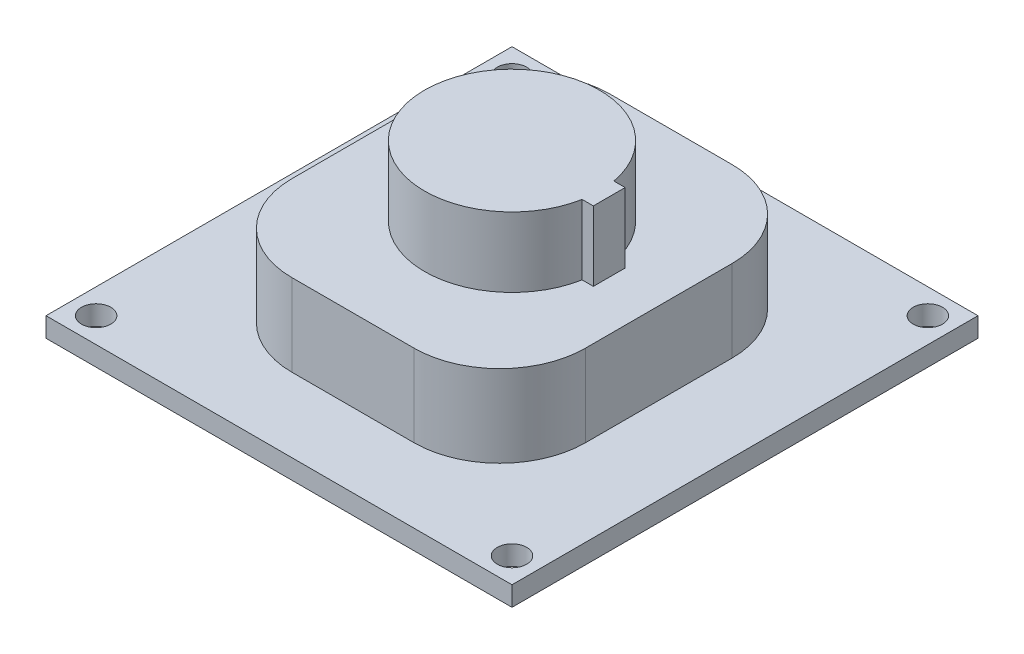
ISO-10303-21;
HEADER;
FILE_DESCRIPTION(('STEP AP214'),'2;1');
FILE_NAME('part.step','',(''),(''),'','','');
FILE_SCHEMA(('AUTOMOTIVE_DESIGN { 1 0 10303 214 1 1 1 1 }'));
ENDSEC;
DATA;
#1=APPLICATION_CONTEXT('core data for automotive mechanical design processes');
#2=APPLICATION_PROTOCOL_DEFINITION('international standard','automotive_design',2000,#1);
#3=PRODUCT_CONTEXT('',#1,'mechanical');
#4=PRODUCT('Part','Part','',(#3));
#5=PRODUCT_RELATED_PRODUCT_CATEGORY('part','',(#4));
#6=PRODUCT_DEFINITION_FORMATION('','',#4);
#7=PRODUCT_DEFINITION_CONTEXT('part definition',#1,'design');
#8=PRODUCT_DEFINITION('design','',#6,#7);
#9=PRODUCT_DEFINITION_SHAPE('','',#8);
#10=(LENGTH_UNIT() NAMED_UNIT(*) SI_UNIT(.MILLI.,.METRE.));
#11=(NAMED_UNIT(*) PLANE_ANGLE_UNIT() SI_UNIT($,.RADIAN.));
#12=(NAMED_UNIT(*) SI_UNIT($,.STERADIAN.) SOLID_ANGLE_UNIT());
#13=UNCERTAINTY_MEASURE_WITH_UNIT(LENGTH_MEASURE(1.E-05),#10,'distance_accuracy_value','');
#14=(GEOMETRIC_REPRESENTATION_CONTEXT(3) GLOBAL_UNCERTAINTY_ASSIGNED_CONTEXT((#13)) GLOBAL_UNIT_ASSIGNED_CONTEXT((#10,
#11,#12)) REPRESENTATION_CONTEXT('',''));
#15=CARTESIAN_POINT('',(0.,0.,0.));
#16=DIRECTION('',(0.,0.,1.));
#17=DIRECTION('',(1.,0.,0.));
#18=AXIS2_PLACEMENT_3D('',#15,#16,#17);
#19=CARTESIAN_POINT('',(5.,8.3,-6.));
#20=DIRECTION('',(0.,-1.,0.));
#21=DIRECTION('',(0.,0.,-1.));
#22=AXIS2_PLACEMENT_3D('',#19,#20,#21);
#23=PLANE('',#22);
#24=CARTESIAN_POINT('',(5.,8.3,-6.));
#25=DIRECTION('',(0.,1.,0.));
#26=DIRECTION('',(0.,0.,-1.));
#27=AXIS2_PLACEMENT_3D('',#24,#25,#26);
#28=CIRCLE('',#27,7.);
#29=CARTESIAN_POINT('',(12.,8.3,-6.));
#30=VERTEX_POINT('',#29);
#31=CARTESIAN_POINT('',(5.,8.3,-13.));
#32=VERTEX_POINT('',#31);
#33=EDGE_CURVE('E185',#30,#32,#28,.T.);
#34=ORIENTED_EDGE('',*,*,#33,.T.);
#35=DIRECTION('',(-1.,0.,0.));
#36=VECTOR('',#35,1.);
#37=CARTESIAN_POINT('',(-5.,8.3,-13.));
#38=LINE('',#37,#36);
#39=CARTESIAN_POINT('',(-5.,8.3,-13.));
#40=VERTEX_POINT('',#39);
#41=EDGE_CURVE('E188',#32,#40,#38,.T.);
#42=ORIENTED_EDGE('',*,*,#41,.T.);
#43=CARTESIAN_POINT('',(-5.,8.3,-6.));
#44=DIRECTION('',(0.,1.,0.));
#45=DIRECTION('',(0.,0.,1.));
#46=AXIS2_PLACEMENT_3D('',#43,#44,#45);
#47=CIRCLE('',#46,7.);
#48=CARTESIAN_POINT('',(-12.,8.3,-6.));
#49=VERTEX_POINT('',#48);
#50=EDGE_CURVE('E191',#40,#49,#47,.T.);
#51=ORIENTED_EDGE('',*,*,#50,.T.);
#52=DIRECTION('',(0.,0.,1.));
#53=VECTOR('',#52,1.);
#54=CARTESIAN_POINT('',(-12.,8.3,-6.));
#55=LINE('',#54,#53);
#56=CARTESIAN_POINT('',(-12.,8.3,6.));
#57=VERTEX_POINT('',#56);
#58=EDGE_CURVE('E193',#49,#57,#55,.T.);
#59=ORIENTED_EDGE('',*,*,#58,.T.);
#60=CARTESIAN_POINT('',(-5.,8.3,6.));
#61=DIRECTION('',(0.,1.,0.));
#62=DIRECTION('',(0.,0.,1.));
#63=AXIS2_PLACEMENT_3D('',#60,#61,#62);
#64=CIRCLE('',#63,7.);
#65=CARTESIAN_POINT('',(-5.,8.3,13.));
#66=VERTEX_POINT('',#65);
#67=EDGE_CURVE('E195',#57,#66,#64,.T.);
#68=ORIENTED_EDGE('',*,*,#67,.T.);
#69=DIRECTION('',(1.,0.,0.));
#70=VECTOR('',#69,1.);
#71=CARTESIAN_POINT('',(-5.,8.3,13.));
#72=LINE('',#71,#70);
#73=CARTESIAN_POINT('',(5.,8.3,13.));
#74=VERTEX_POINT('',#73);
#75=EDGE_CURVE('E197',#66,#74,#72,.T.);
#76=ORIENTED_EDGE('',*,*,#75,.T.);
#77=CARTESIAN_POINT('',(5.,8.3,6.));
#78=DIRECTION('',(0.,1.,0.));
#79=DIRECTION('',(0.,0.,1.));
#80=AXIS2_PLACEMENT_3D('',#77,#78,#79);
#81=CIRCLE('',#80,7.);
#82=CARTESIAN_POINT('',(12.,8.3,6.));
#83=VERTEX_POINT('',#82);
#84=EDGE_CURVE('E199',#74,#83,#81,.T.);
#85=ORIENTED_EDGE('',*,*,#84,.T.);
#86=DIRECTION('',(0.,0.,-1.));
#87=VECTOR('',#86,1.);
#88=CARTESIAN_POINT('',(12.,8.3,-6.));
#89=LINE('',#88,#87);
#90=EDGE_CURVE('E201',#83,#30,#89,.T.);
#91=ORIENTED_EDGE('',*,*,#90,.T.);
#92=EDGE_LOOP('',(#34,#42,#51,#59,#68,#76,#85,#91));
#93=FACE_BOUND('',#92,.T.);
#94=CARTESIAN_POINT('',(0.,8.3,0.));
#95=DIRECTION('',(0.,1.,0.));
#96=DIRECTION('',(0.,0.,1.));
#97=AXIS2_PLACEMENT_3D('',#94,#95,#96);
#98=CIRCLE('',#97,7.15);
#99=CARTESIAN_POINT('',(7.03082498715478,8.3,-1.3));
#100=VERTEX_POINT('',#99);
#101=CARTESIAN_POINT('',(7.03082498715478,8.3,1.3));
#102=VERTEX_POINT('',#101);
#103=EDGE_CURVE('E58',#100,#102,#98,.T.);
#104=ORIENTED_EDGE('',*,*,#103,.F.);
#105=DIRECTION('',(-1.,0.,0.));
#106=VECTOR('',#105,1.);
#107=CARTESIAN_POINT('',(7.03082498715478,8.3,-1.3));
#108=LINE('',#107,#106);
#109=CARTESIAN_POINT('',(7.95,8.3,-1.3));
#110=VERTEX_POINT('',#109);
#111=EDGE_CURVE('E62',#110,#100,#108,.T.);
#112=ORIENTED_EDGE('',*,*,#111,.F.);
#113=DIRECTION('',(0.,0.,-1.));
#114=VECTOR('',#113,1.);
#115=CARTESIAN_POINT('',(7.95,8.3,-1.3));
#116=LINE('',#115,#114);
#117=CARTESIAN_POINT('',(7.95,8.3,1.3));
#118=VERTEX_POINT('',#117);
#119=EDGE_CURVE('E514',#118,#110,#116,.T.);
#120=ORIENTED_EDGE('',*,*,#119,.F.);
#121=DIRECTION('',(1.,0.,0.));
#122=VECTOR('',#121,1.);
#123=CARTESIAN_POINT('',(7.03082498715478,8.3,1.3));
#124=LINE('',#123,#122);
#125=EDGE_CURVE('E520',#102,#118,#124,.T.);
#126=ORIENTED_EDGE('',*,*,#125,.F.);
#127=EDGE_LOOP('',(#104,#112,#120,#126));
#128=FACE_BOUND('',#127,.T.);
#129=ADVANCED_FACE('F43',(#93,#128),#23,.F.);
#130=CARTESIAN_POINT('',(0.,1.6,0.));
#131=DIRECTION('',(0.,1.,0.));
#132=DIRECTION('',(0.,0.,1.));
#133=AXIS2_PLACEMENT_3D('',#130,#131,#132);
#134=PLANE('',#133);
#135=CARTESIAN_POINT('',(5.,1.6,-6.));
#136=DIRECTION('',(0.,1.,0.));
#137=DIRECTION('',(0.,0.,-1.));
#138=AXIS2_PLACEMENT_3D('',#135,#136,#137);
#139=CIRCLE('',#138,7.);
#140=CARTESIAN_POINT('',(12.,1.6,-6.));
#141=VERTEX_POINT('',#140);
#142=CARTESIAN_POINT('',(5.,1.6,-13.));
#143=VERTEX_POINT('',#142);
#144=EDGE_CURVE('E176',#141,#143,#139,.T.);
#145=ORIENTED_EDGE('',*,*,#144,.F.);
#146=DIRECTION('',(0.,0.,-1.));
#147=VECTOR('',#146,1.);
#148=CARTESIAN_POINT('',(12.,1.6,-6.));
#149=LINE('',#148,#147);
#150=CARTESIAN_POINT('',(12.,1.6,6.));
#151=VERTEX_POINT('',#150);
#152=EDGE_CURVE('E189',#151,#141,#149,.T.);
#153=ORIENTED_EDGE('',*,*,#152,.F.);
#154=CARTESIAN_POINT('',(5.,1.6,6.));
#155=DIRECTION('',(0.,1.,0.));
#156=DIRECTION('',(0.,0.,1.));
#157=AXIS2_PLACEMENT_3D('',#154,#155,#156);
#158=CIRCLE('',#157,7.);
#159=CARTESIAN_POINT('',(5.,1.6,13.));
#160=VERTEX_POINT('',#159);
#161=EDGE_CURVE('E218',#160,#151,#158,.T.);
#162=ORIENTED_EDGE('',*,*,#161,.F.);
#163=DIRECTION('',(1.,0.,0.));
#164=VECTOR('',#163,1.);
#165=CARTESIAN_POINT('',(-5.,1.6,13.));
#166=LINE('',#165,#164);
#167=CARTESIAN_POINT('',(-5.,1.6,13.));
#168=VERTEX_POINT('',#167);
#169=EDGE_CURVE('E215',#168,#160,#166,.T.);
#170=ORIENTED_EDGE('',*,*,#169,.F.);
#171=CARTESIAN_POINT('',(-5.,1.6,6.));
#172=DIRECTION('',(0.,1.,0.));
#173=DIRECTION('',(0.,0.,1.));
#174=AXIS2_PLACEMENT_3D('',#171,#172,#173);
#175=CIRCLE('',#174,7.);
#176=CARTESIAN_POINT('',(-12.,1.6,6.));
#177=VERTEX_POINT('',#176);
#178=EDGE_CURVE('E212',#177,#168,#175,.T.);
#179=ORIENTED_EDGE('',*,*,#178,.F.);
#180=DIRECTION('',(0.,0.,1.));
#181=VECTOR('',#180,1.);
#182=CARTESIAN_POINT('',(-12.,1.6,-6.));
#183=LINE('',#182,#181);
#184=CARTESIAN_POINT('',(-12.,1.6,-6.));
#185=VERTEX_POINT('',#184);
#186=EDGE_CURVE('E209',#185,#177,#183,.T.);
#187=ORIENTED_EDGE('',*,*,#186,.F.);
#188=CARTESIAN_POINT('',(-5.,1.6,-6.));
#189=DIRECTION('',(0.,1.,0.));
#190=DIRECTION('',(0.,0.,1.));
#191=AXIS2_PLACEMENT_3D('',#188,#189,#190);
#192=CIRCLE('',#191,7.);
#193=CARTESIAN_POINT('',(-5.,1.6,-13.));
#194=VERTEX_POINT('',#193);
#195=EDGE_CURVE('E206',#194,#185,#192,.T.);
#196=ORIENTED_EDGE('',*,*,#195,.F.);
#197=DIRECTION('',(-1.,0.,0.));
#198=VECTOR('',#197,1.);
#199=CARTESIAN_POINT('',(-5.,1.6,-13.));
#200=LINE('',#199,#198);
#201=EDGE_CURVE('E179',#143,#194,#200,.T.);
#202=ORIENTED_EDGE('',*,*,#201,.F.);
#203=EDGE_LOOP('',(#145,#153,#162,#170,#179,#187,#196,#202));
#204=FACE_BOUND('',#203,.T.);
#205=CARTESIAN_POINT('',(17.,1.6,17.));
#206=DIRECTION('',(0.,1.,0.));
#207=DIRECTION('',(0.,0.,1.));
#208=AXIS2_PLACEMENT_3D('',#205,#206,#207);
#209=CIRCLE('',#208,1.2);
#210=CARTESIAN_POINT('',(17.,1.6,18.2));
#211=VERTEX_POINT('',#210);
#212=EDGE_CURVE('E253',#211,#211,#209,.T.);
#213=ORIENTED_EDGE('',*,*,#212,.F.);
#214=EDGE_LOOP('',(#213));
#215=FACE_BOUND('',#214,.T.);
#216=CARTESIAN_POINT('',(-17.,1.6,-17.));
#217=DIRECTION('',(0.,1.,0.));
#218=DIRECTION('',(0.,0.,1.));
#219=AXIS2_PLACEMENT_3D('',#216,#217,#218);
#220=CIRCLE('',#219,1.2);
#221=CARTESIAN_POINT('',(-17.,1.6,-15.8));
#222=VERTEX_POINT('',#221);
#223=EDGE_CURVE('E265',#222,#222,#220,.T.);
#224=ORIENTED_EDGE('',*,*,#223,.F.);
#225=EDGE_LOOP('',(#224));
#226=FACE_BOUND('',#225,.T.);
#227=DIRECTION('',(0.,0.,1.));
#228=VECTOR('',#227,1.);
#229=CARTESIAN_POINT('',(-19.05,1.6,-19.05));
#230=LINE('',#229,#228);
#231=CARTESIAN_POINT('',(-19.05,1.6,-19.05));
#232=VERTEX_POINT('',#231);
#233=CARTESIAN_POINT('',(-19.05,1.6,19.05));
#234=VERTEX_POINT('',#233);
#235=EDGE_CURVE('E271',#232,#234,#230,.T.);
#236=ORIENTED_EDGE('',*,*,#235,.T.);
#237=DIRECTION('',(1.,0.,0.));
#238=VECTOR('',#237,1.);
#239=CARTESIAN_POINT('',(-19.05,1.6,19.05));
#240=LINE('',#239,#238);
#241=CARTESIAN_POINT('',(19.05,1.6,19.05));
#242=VERTEX_POINT('',#241);
#243=EDGE_CURVE('E274',#234,#242,#240,.T.);
#244=ORIENTED_EDGE('',*,*,#243,.T.);
#245=DIRECTION('',(0.,0.,-1.));
#246=VECTOR('',#245,1.);
#247=CARTESIAN_POINT('',(19.05,1.6,-19.05));
#248=LINE('',#247,#246);
#249=CARTESIAN_POINT('',(19.05,1.6,-19.05));
#250=VERTEX_POINT('',#249);
#251=EDGE_CURVE('E277',#242,#250,#248,.T.);
#252=ORIENTED_EDGE('',*,*,#251,.T.);
#253=DIRECTION('',(-1.,0.,0.));
#254=VECTOR('',#253,1.);
#255=CARTESIAN_POINT('',(-19.05,1.6,-19.05));
#256=LINE('',#255,#254);
#257=EDGE_CURVE('E279',#250,#232,#256,.T.);
#258=ORIENTED_EDGE('',*,*,#257,.T.);
#259=EDGE_LOOP('',(#236,#244,#252,#258));
#260=FACE_BOUND('',#259,.T.);
#261=CARTESIAN_POINT('',(17.,1.6,-17.));
#262=DIRECTION('',(0.,1.,0.));
#263=DIRECTION('',(0.,0.,1.));
#264=AXIS2_PLACEMENT_3D('',#261,#262,#263);
#265=CIRCLE('',#264,1.2);
#266=CARTESIAN_POINT('',(17.,1.6,-15.8));
#267=VERTEX_POINT('',#266);
#268=EDGE_CURVE('E259',#267,#267,#265,.T.);
#269=ORIENTED_EDGE('',*,*,#268,.F.);
#270=EDGE_LOOP('',(#269));
#271=FACE_BOUND('',#270,.T.);
#272=CARTESIAN_POINT('',(-17.,1.6,17.));
#273=DIRECTION('',(0.,1.,0.));
#274=DIRECTION('',(0.,0.,1.));
#275=AXIS2_PLACEMENT_3D('',#272,#273,#274);
#276=CIRCLE('',#275,1.2);
#277=CARTESIAN_POINT('',(-17.,1.6,18.2));
#278=VERTEX_POINT('',#277);
#279=EDGE_CURVE('E247',#278,#278,#276,.T.);
#280=ORIENTED_EDGE('',*,*,#279,.F.);
#281=EDGE_LOOP('',(#280));
#282=FACE_BOUND('',#281,.T.);
#283=ADVANCED_FACE('F314',(#204,#215,#226,#260,#271,#282),#134,.T.);
#284=CARTESIAN_POINT('',(0.,0.,0.));
#285=DIRECTION('',(0.,1.,0.));
#286=DIRECTION('',(0.,0.,1.));
#287=AXIS2_PLACEMENT_3D('',#284,#285,#286);
#288=PLANE('',#287);
#289=DIRECTION('',(0.,0.,1.));
#290=VECTOR('',#289,1.);
#291=CARTESIAN_POINT('',(-19.05,0.,-19.05));
#292=LINE('',#291,#290);
#293=CARTESIAN_POINT('',(-19.05,0.,-19.05));
#294=VERTEX_POINT('',#293);
#295=CARTESIAN_POINT('',(-19.05,0.,19.05));
#296=VERTEX_POINT('',#295);
#297=EDGE_CURVE('E268',#294,#296,#292,.T.);
#298=ORIENTED_EDGE('',*,*,#297,.F.);
#299=DIRECTION('',(-1.,0.,0.));
#300=VECTOR('',#299,1.);
#301=CARTESIAN_POINT('',(-19.05,0.,-19.05));
#302=LINE('',#301,#300);
#303=CARTESIAN_POINT('',(19.05,0.,-19.05));
#304=VERTEX_POINT('',#303);
#305=EDGE_CURVE('E275',#304,#294,#302,.T.);
#306=ORIENTED_EDGE('',*,*,#305,.F.);
#307=DIRECTION('',(0.,0.,-1.));
#308=VECTOR('',#307,1.);
#309=CARTESIAN_POINT('',(19.05,0.,-19.05));
#310=LINE('',#309,#308);
#311=CARTESIAN_POINT('',(19.05,0.,19.05));
#312=VERTEX_POINT('',#311);
#313=EDGE_CURVE('E286',#312,#304,#310,.T.);
#314=ORIENTED_EDGE('',*,*,#313,.F.);
#315=DIRECTION('',(1.,0.,0.));
#316=VECTOR('',#315,1.);
#317=CARTESIAN_POINT('',(-19.05,0.,19.05));
#318=LINE('',#317,#316);
#319=EDGE_CURVE('E284',#296,#312,#318,.T.);
#320=ORIENTED_EDGE('',*,*,#319,.F.);
#321=EDGE_LOOP('',(#298,#306,#314,#320));
#322=FACE_BOUND('',#321,.T.);
#323=CARTESIAN_POINT('',(-17.,0.,-17.));
#324=DIRECTION('',(0.,1.,0.));
#325=DIRECTION('',(0.,0.,1.));
#326=AXIS2_PLACEMENT_3D('',#323,#324,#325);
#327=CIRCLE('',#326,1.2);
#328=CARTESIAN_POINT('',(-17.,0.,-15.8));
#329=VERTEX_POINT('',#328);
#330=EDGE_CURVE('E262',#329,#329,#327,.T.);
#331=ORIENTED_EDGE('',*,*,#330,.T.);
#332=EDGE_LOOP('',(#331));
#333=FACE_BOUND('',#332,.T.);
#334=CARTESIAN_POINT('',(17.,0.,-17.));
#335=DIRECTION('',(0.,1.,0.));
#336=DIRECTION('',(0.,0.,1.));
#337=AXIS2_PLACEMENT_3D('',#334,#335,#336);
#338=CIRCLE('',#337,1.2);
#339=CARTESIAN_POINT('',(17.,0.,-15.8));
#340=VERTEX_POINT('',#339);
#341=EDGE_CURVE('E256',#340,#340,#338,.T.);
#342=ORIENTED_EDGE('',*,*,#341,.T.);
#343=EDGE_LOOP('',(#342));
#344=FACE_BOUND('',#343,.T.);
#345=CARTESIAN_POINT('',(17.,0.,17.));
#346=DIRECTION('',(0.,1.,0.));
#347=DIRECTION('',(0.,0.,1.));
#348=AXIS2_PLACEMENT_3D('',#345,#346,#347);
#349=CIRCLE('',#348,1.2);
#350=CARTESIAN_POINT('',(17.,0.,18.2));
#351=VERTEX_POINT('',#350);
#352=EDGE_CURVE('E250',#351,#351,#349,.T.);
#353=ORIENTED_EDGE('',*,*,#352,.T.);
#354=EDGE_LOOP('',(#353));
#355=FACE_BOUND('',#354,.T.);
#356=CARTESIAN_POINT('',(-17.,0.,17.));
#357=DIRECTION('',(0.,1.,0.));
#358=DIRECTION('',(0.,0.,1.));
#359=AXIS2_PLACEMENT_3D('',#356,#357,#358);
#360=CIRCLE('',#359,1.2);
#361=CARTESIAN_POINT('',(-17.,0.,18.2));
#362=VERTEX_POINT('',#361);
#363=EDGE_CURVE('E246',#362,#362,#360,.T.);
#364=ORIENTED_EDGE('',*,*,#363,.T.);
#365=EDGE_LOOP('',(#364));
#366=FACE_BOUND('',#365,.T.);
#367=ADVANCED_FACE('F304',(#322,#333,#344,#355,#366),#288,.F.);
#368=CARTESIAN_POINT('',(-19.05,1.6,-19.05));
#369=DIRECTION('',(1.,0.,0.));
#370=DIRECTION('',(0.,0.,-1.));
#371=AXIS2_PLACEMENT_3D('',#368,#369,#370);
#372=PLANE('',#371);
#373=ORIENTED_EDGE('',*,*,#297,.T.);
#374=DIRECTION('',(0.,-1.,0.));
#375=VECTOR('',#374,1.);
#376=CARTESIAN_POINT('',(-19.05,1.6,19.05));
#377=LINE('',#376,#375);
#378=EDGE_CURVE('E11',#234,#296,#377,.T.);
#379=ORIENTED_EDGE('',*,*,#378,.F.);
#380=ORIENTED_EDGE('',*,*,#235,.F.);
#381=DIRECTION('',(0.,-1.,0.));
#382=VECTOR('',#381,1.);
#383=CARTESIAN_POINT('',(-19.05,1.6,-19.05));
#384=LINE('',#383,#382);
#385=EDGE_CURVE('E281',#232,#294,#384,.T.);
#386=ORIENTED_EDGE('',*,*,#385,.T.);
#387=EDGE_LOOP('',(#373,#379,#380,#386));
#388=FACE_BOUND('',#387,.T.);
#389=ADVANCED_FACE('F45',(#388),#372,.F.);
#390=CARTESIAN_POINT('',(-19.05,1.6,19.05));
#391=DIRECTION('',(0.,0.,-1.));
#392=DIRECTION('',(-1.,0.,0.));
#393=AXIS2_PLACEMENT_3D('',#390,#391,#392);
#394=PLANE('',#393);
#395=ORIENTED_EDGE('',*,*,#319,.T.);
#396=DIRECTION('',(0.,-1.,0.));
#397=VECTOR('',#396,1.);
#398=CARTESIAN_POINT('',(19.05,1.6,19.05));
#399=LINE('',#398,#397);
#400=EDGE_CURVE('E51',#242,#312,#399,.T.);
#401=ORIENTED_EDGE('',*,*,#400,.F.);
#402=ORIENTED_EDGE('',*,*,#243,.F.);
#403=ORIENTED_EDGE('',*,*,#378,.T.);
#404=EDGE_LOOP('',(#395,#401,#402,#403));
#405=FACE_BOUND('',#404,.T.);
#406=ADVANCED_FACE('F316',(#405),#394,.F.);
#407=CARTESIAN_POINT('',(19.05,1.6,-19.05));
#408=DIRECTION('',(-1.,0.,0.));
#409=DIRECTION('',(0.,0.,1.));
#410=AXIS2_PLACEMENT_3D('',#407,#408,#409);
#411=PLANE('',#410);
#412=ORIENTED_EDGE('',*,*,#313,.T.);
#413=DIRECTION('',(0.,-1.,0.));
#414=VECTOR('',#413,1.);
#415=CARTESIAN_POINT('',(19.05,1.6,-19.05));
#416=LINE('',#415,#414);
#417=EDGE_CURVE('E291',#250,#304,#416,.T.);
#418=ORIENTED_EDGE('',*,*,#417,.F.);
#419=ORIENTED_EDGE('',*,*,#251,.F.);
#420=ORIENTED_EDGE('',*,*,#400,.T.);
#421=EDGE_LOOP('',(#412,#418,#419,#420));
#422=FACE_BOUND('',#421,.T.);
#423=ADVANCED_FACE('F298',(#422),#411,.F.);
#424=CARTESIAN_POINT('',(-19.05,1.6,-19.05));
#425=DIRECTION('',(0.,0.,1.));
#426=DIRECTION('',(1.,0.,0.));
#427=AXIS2_PLACEMENT_3D('',#424,#425,#426);
#428=PLANE('',#427);
#429=ORIENTED_EDGE('',*,*,#305,.T.);
#430=ORIENTED_EDGE('',*,*,#385,.F.);
#431=ORIENTED_EDGE('',*,*,#257,.F.);
#432=ORIENTED_EDGE('',*,*,#417,.T.);
#433=EDGE_LOOP('',(#429,#430,#431,#432));
#434=FACE_BOUND('',#433,.T.);
#435=ADVANCED_FACE('F308',(#434),#428,.F.);
#436=CARTESIAN_POINT('',(-17.,1.6,-17.));
#437=DIRECTION('',(0.,-1.,0.));
#438=DIRECTION('',(0.,0.,-1.));
#439=AXIS2_PLACEMENT_3D('',#436,#437,#438);
#440=CYLINDRICAL_SURFACE('',#439,1.2);
#441=ORIENTED_EDGE('',*,*,#223,.T.);
#442=EDGE_LOOP('',(#441));
#443=FACE_BOUND('',#442,.T.);
#444=ORIENTED_EDGE('',*,*,#330,.F.);
#445=EDGE_LOOP('',(#444));
#446=FACE_BOUND('',#445,.T.);
#447=ADVANCED_FACE('F378',(#443,#446),#440,.F.);
#448=CARTESIAN_POINT('',(17.,1.6,-17.));
#449=DIRECTION('',(0.,-1.,0.));
#450=DIRECTION('',(0.,0.,-1.));
#451=AXIS2_PLACEMENT_3D('',#448,#449,#450);
#452=CYLINDRICAL_SURFACE('',#451,1.2);
#453=ORIENTED_EDGE('',*,*,#268,.T.);
#454=EDGE_LOOP('',(#453));
#455=FACE_BOUND('',#454,.T.);
#456=ORIENTED_EDGE('',*,*,#341,.F.);
#457=EDGE_LOOP('',(#456));
#458=FACE_BOUND('',#457,.T.);
#459=ADVANCED_FACE('F374',(#455,#458),#452,.F.);
#460=CARTESIAN_POINT('',(17.,1.6,17.));
#461=DIRECTION('',(0.,-1.,0.));
#462=DIRECTION('',(0.,0.,-1.));
#463=AXIS2_PLACEMENT_3D('',#460,#461,#462);
#464=CYLINDRICAL_SURFACE('',#463,1.2);
#465=ORIENTED_EDGE('',*,*,#212,.T.);
#466=EDGE_LOOP('',(#465));
#467=FACE_BOUND('',#466,.T.);
#468=ORIENTED_EDGE('',*,*,#352,.F.);
#469=EDGE_LOOP('',(#468));
#470=FACE_BOUND('',#469,.T.);
#471=ADVANCED_FACE('F370',(#467,#470),#464,.F.);
#472=CARTESIAN_POINT('',(-17.,1.6,17.));
#473=DIRECTION('',(0.,-1.,0.));
#474=DIRECTION('',(0.,0.,-1.));
#475=AXIS2_PLACEMENT_3D('',#472,#473,#474);
#476=CYLINDRICAL_SURFACE('',#475,1.2);
#477=ORIENTED_EDGE('',*,*,#279,.T.);
#478=EDGE_LOOP('',(#477));
#479=FACE_BOUND('',#478,.T.);
#480=ORIENTED_EDGE('',*,*,#363,.F.);
#481=EDGE_LOOP('',(#480));
#482=FACE_BOUND('',#481,.T.);
#483=ADVANCED_FACE('F366',(#479,#482),#476,.F.);
#484=CARTESIAN_POINT('',(5.,8.3,-6.));
#485=DIRECTION('',(0.,-1.,0.));
#486=DIRECTION('',(0.,0.,-1.));
#487=AXIS2_PLACEMENT_3D('',#484,#485,#486);
#488=CYLINDRICAL_SURFACE('',#487,7.);
#489=ORIENTED_EDGE('',*,*,#144,.T.);
#490=DIRECTION('',(0.,-1.,0.));
#491=VECTOR('',#490,1.);
#492=CARTESIAN_POINT('',(5.,8.3,-13.));
#493=LINE('',#492,#491);
#494=EDGE_CURVE('E243',#32,#143,#493,.T.);
#495=ORIENTED_EDGE('',*,*,#494,.F.);
#496=ORIENTED_EDGE('',*,*,#33,.F.);
#497=DIRECTION('',(0.,-1.,0.));
#498=VECTOR('',#497,1.);
#499=CARTESIAN_POINT('',(12.,8.3,-6.));
#500=LINE('',#499,#498);
#501=EDGE_CURVE('E202',#30,#141,#500,.T.);
#502=ORIENTED_EDGE('',*,*,#501,.T.);
#503=EDGE_LOOP('',(#489,#495,#496,#502));
#504=FACE_BOUND('',#503,.T.);
#505=ADVANCED_FACE('F362',(#504),#488,.T.);
#506=CARTESIAN_POINT('',(-5.,8.3,-13.));
#507=DIRECTION('',(0.,0.,1.));
#508=DIRECTION('',(1.,0.,0.));
#509=AXIS2_PLACEMENT_3D('',#506,#507,#508);
#510=PLANE('',#509);
#511=ORIENTED_EDGE('',*,*,#201,.T.);
#512=DIRECTION('',(0.,-1.,0.));
#513=VECTOR('',#512,1.);
#514=CARTESIAN_POINT('',(-5.,8.3,-13.));
#515=LINE('',#514,#513);
#516=EDGE_CURVE('E240',#40,#194,#515,.T.);
#517=ORIENTED_EDGE('',*,*,#516,.F.);
#518=ORIENTED_EDGE('',*,*,#41,.F.);
#519=ORIENTED_EDGE('',*,*,#494,.T.);
#520=EDGE_LOOP('',(#511,#517,#518,#519));
#521=FACE_BOUND('',#520,.T.);
#522=ADVANCED_FACE('F358',(#521),#510,.F.);
#523=CARTESIAN_POINT('',(-5.,8.3,-6.));
#524=DIRECTION('',(0.,-1.,0.));
#525=DIRECTION('',(0.,0.,-1.));
#526=AXIS2_PLACEMENT_3D('',#523,#524,#525);
#527=CYLINDRICAL_SURFACE('',#526,7.);
#528=ORIENTED_EDGE('',*,*,#195,.T.);
#529=DIRECTION('',(0.,-1.,0.));
#530=VECTOR('',#529,1.);
#531=CARTESIAN_POINT('',(-12.,8.3,-6.));
#532=LINE('',#531,#530);
#533=EDGE_CURVE('E237',#49,#185,#532,.T.);
#534=ORIENTED_EDGE('',*,*,#533,.F.);
#535=ORIENTED_EDGE('',*,*,#50,.F.);
#536=ORIENTED_EDGE('',*,*,#516,.T.);
#537=EDGE_LOOP('',(#528,#534,#535,#536));
#538=FACE_BOUND('',#537,.T.);
#539=ADVANCED_FACE('F354',(#538),#527,.T.);
#540=CARTESIAN_POINT('',(-12.,8.3,-6.));
#541=DIRECTION('',(1.,0.,0.));
#542=DIRECTION('',(0.,0.,-1.));
#543=AXIS2_PLACEMENT_3D('',#540,#541,#542);
#544=PLANE('',#543);
#545=ORIENTED_EDGE('',*,*,#186,.T.);
#546=DIRECTION('',(0.,-1.,0.));
#547=VECTOR('',#546,1.);
#548=CARTESIAN_POINT('',(-12.,8.3,6.));
#549=LINE('',#548,#547);
#550=EDGE_CURVE('E234',#57,#177,#549,.T.);
#551=ORIENTED_EDGE('',*,*,#550,.F.);
#552=ORIENTED_EDGE('',*,*,#58,.F.);
#553=ORIENTED_EDGE('',*,*,#533,.T.);
#554=EDGE_LOOP('',(#545,#551,#552,#553));
#555=FACE_BOUND('',#554,.T.);
#556=ADVANCED_FACE('F350',(#555),#544,.F.);
#557=CARTESIAN_POINT('',(-5.,8.3,6.));
#558=DIRECTION('',(0.,-1.,0.));
#559=DIRECTION('',(0.,0.,-1.));
#560=AXIS2_PLACEMENT_3D('',#557,#558,#559);
#561=CYLINDRICAL_SURFACE('',#560,7.);
#562=ORIENTED_EDGE('',*,*,#178,.T.);
#563=DIRECTION('',(0.,-1.,0.));
#564=VECTOR('',#563,1.);
#565=CARTESIAN_POINT('',(-5.,8.3,13.));
#566=LINE('',#565,#564);
#567=EDGE_CURVE('E231',#66,#168,#566,.T.);
#568=ORIENTED_EDGE('',*,*,#567,.F.);
#569=ORIENTED_EDGE('',*,*,#67,.F.);
#570=ORIENTED_EDGE('',*,*,#550,.T.);
#571=EDGE_LOOP('',(#562,#568,#569,#570));
#572=FACE_BOUND('',#571,.T.);
#573=ADVANCED_FACE('F346',(#572),#561,.T.);
#574=CARTESIAN_POINT('',(-5.,8.3,13.));
#575=DIRECTION('',(0.,0.,-1.));
#576=DIRECTION('',(-1.,0.,0.));
#577=AXIS2_PLACEMENT_3D('',#574,#575,#576);
#578=PLANE('',#577);
#579=ORIENTED_EDGE('',*,*,#169,.T.);
#580=DIRECTION('',(0.,-1.,0.));
#581=VECTOR('',#580,1.);
#582=CARTESIAN_POINT('',(5.,8.3,13.));
#583=LINE('',#582,#581);
#584=EDGE_CURVE('E228',#74,#160,#583,.T.);
#585=ORIENTED_EDGE('',*,*,#584,.F.);
#586=ORIENTED_EDGE('',*,*,#75,.F.);
#587=ORIENTED_EDGE('',*,*,#567,.T.);
#588=EDGE_LOOP('',(#579,#585,#586,#587));
#589=FACE_BOUND('',#588,.T.);
#590=ADVANCED_FACE('F342',(#589),#578,.F.);
#591=CARTESIAN_POINT('',(5.,8.3,6.));
#592=DIRECTION('',(0.,-1.,0.));
#593=DIRECTION('',(0.,0.,-1.));
#594=AXIS2_PLACEMENT_3D('',#591,#592,#593);
#595=CYLINDRICAL_SURFACE('',#594,7.);
#596=ORIENTED_EDGE('',*,*,#161,.T.);
#597=DIRECTION('',(0.,-1.,0.));
#598=VECTOR('',#597,1.);
#599=CARTESIAN_POINT('',(12.,8.3,6.));
#600=LINE('',#599,#598);
#601=EDGE_CURVE('E225',#83,#151,#600,.T.);
#602=ORIENTED_EDGE('',*,*,#601,.F.);
#603=ORIENTED_EDGE('',*,*,#84,.F.);
#604=ORIENTED_EDGE('',*,*,#584,.T.);
#605=EDGE_LOOP('',(#596,#602,#603,#604));
#606=FACE_BOUND('',#605,.T.);
#607=ADVANCED_FACE('F338',(#606),#595,.T.);
#608=CARTESIAN_POINT('',(12.,8.3,-6.));
#609=DIRECTION('',(-1.,0.,0.));
#610=DIRECTION('',(0.,0.,1.));
#611=AXIS2_PLACEMENT_3D('',#608,#609,#610);
#612=PLANE('',#611);
#613=ORIENTED_EDGE('',*,*,#152,.T.);
#614=ORIENTED_EDGE('',*,*,#501,.F.);
#615=ORIENTED_EDGE('',*,*,#90,.F.);
#616=ORIENTED_EDGE('',*,*,#601,.T.);
#617=EDGE_LOOP('',(#613,#614,#615,#616));
#618=FACE_BOUND('',#617,.T.);
#619=ADVANCED_FACE('F336',(#618),#612,.F.);
#620=CARTESIAN_POINT('',(0.,14.,0.));
#621=DIRECTION('',(0.,-1.,0.));
#622=DIRECTION('',(0.,0.,-1.));
#623=AXIS2_PLACEMENT_3D('',#620,#621,#622);
#624=CYLINDRICAL_SURFACE('',#623,7.15);
#625=ORIENTED_EDGE('',*,*,#103,.T.);
#626=DIRECTION('',(0.,-1.,0.));
#627=VECTOR('',#626,1.);
#628=CARTESIAN_POINT('',(7.03082498715478,14.,1.3));
#629=LINE('',#628,#627);
#630=CARTESIAN_POINT('',(7.03082498715478,14.,1.3));
#631=VERTEX_POINT('',#630);
#632=EDGE_CURVE('E159',#631,#102,#629,.T.);
#633=ORIENTED_EDGE('',*,*,#632,.F.);
#634=CARTESIAN_POINT('',(0.,14.,0.));
#635=DIRECTION('',(0.,1.,0.));
#636=DIRECTION('',(0.,0.,1.));
#637=AXIS2_PLACEMENT_3D('',#634,#635,#636);
#638=CIRCLE('',#637,7.15);
#639=CARTESIAN_POINT('',(7.03082498715478,14.,-1.3));
#640=VERTEX_POINT('',#639);
#641=EDGE_CURVE('E165',#640,#631,#638,.T.);
#642=ORIENTED_EDGE('',*,*,#641,.F.);
#643=DIRECTION('',(0.,-1.,0.));
#644=VECTOR('',#643,1.);
#645=CARTESIAN_POINT('',(7.03082498715478,14.,-1.3));
#646=LINE('',#645,#644);
#647=EDGE_CURVE('E512',#640,#100,#646,.T.);
#648=ORIENTED_EDGE('',*,*,#647,.T.);
#649=EDGE_LOOP('',(#625,#633,#642,#648));
#650=FACE_BOUND('',#649,.T.);
#651=ADVANCED_FACE('F175',(#650),#624,.T.);
#652=CARTESIAN_POINT('',(7.03082498715478,14.,1.3));
#653=DIRECTION('',(0.,0.,-1.));
#654=DIRECTION('',(-1.,0.,0.));
#655=AXIS2_PLACEMENT_3D('',#652,#653,#654);
#656=PLANE('',#655);
#657=ORIENTED_EDGE('',*,*,#125,.T.);
#658=DIRECTION('',(0.,-1.,0.));
#659=VECTOR('',#658,1.);
#660=CARTESIAN_POINT('',(7.95,14.,1.3));
#661=LINE('',#660,#659);
#662=CARTESIAN_POINT('',(7.95,14.,1.3));
#663=VERTEX_POINT('',#662);
#664=EDGE_CURVE('E161',#663,#118,#661,.T.);
#665=ORIENTED_EDGE('',*,*,#664,.F.);
#666=DIRECTION('',(1.,0.,0.));
#667=VECTOR('',#666,1.);
#668=CARTESIAN_POINT('',(7.03082498715478,14.,1.3));
#669=LINE('',#668,#667);
#670=EDGE_CURVE('E154',#631,#663,#669,.T.);
#671=ORIENTED_EDGE('',*,*,#670,.F.);
#672=ORIENTED_EDGE('',*,*,#632,.T.);
#673=EDGE_LOOP('',(#657,#665,#671,#672));
#674=FACE_BOUND('',#673,.T.);
#675=ADVANCED_FACE('F157',(#674),#656,.F.);
#676=CARTESIAN_POINT('',(7.95,14.,-1.3));
#677=DIRECTION('',(-1.,0.,0.));
#678=DIRECTION('',(0.,0.,1.));
#679=AXIS2_PLACEMENT_3D('',#676,#677,#678);
#680=PLANE('',#679);
#681=ORIENTED_EDGE('',*,*,#119,.T.);
#682=DIRECTION('',(0.,-1.,0.));
#683=VECTOR('',#682,1.);
#684=CARTESIAN_POINT('',(7.95,14.,-1.3));
#685=LINE('',#684,#683);
#686=CARTESIAN_POINT('',(7.95,14.,-1.3));
#687=VERTEX_POINT('',#686);
#688=EDGE_CURVE('E181',#687,#110,#685,.T.);
#689=ORIENTED_EDGE('',*,*,#688,.F.);
#690=DIRECTION('',(0.,0.,-1.));
#691=VECTOR('',#690,1.);
#692=CARTESIAN_POINT('',(7.95,14.,-1.3));
#693=LINE('',#692,#691);
#694=EDGE_CURVE('E164',#663,#687,#693,.T.);
#695=ORIENTED_EDGE('',*,*,#694,.F.);
#696=ORIENTED_EDGE('',*,*,#664,.T.);
#697=EDGE_LOOP('',(#681,#689,#695,#696));
#698=FACE_BOUND('',#697,.T.);
#699=ADVANCED_FACE('F482',(#698),#680,.F.);
#700=CARTESIAN_POINT('',(7.03082498715478,14.,-1.3));
#701=DIRECTION('',(0.,0.,1.));
#702=DIRECTION('',(1.,0.,0.));
#703=AXIS2_PLACEMENT_3D('',#700,#701,#702);
#704=PLANE('',#703);
#705=ORIENTED_EDGE('',*,*,#111,.T.);
#706=ORIENTED_EDGE('',*,*,#647,.F.);
#707=DIRECTION('',(-1.,0.,0.));
#708=VECTOR('',#707,1.);
#709=CARTESIAN_POINT('',(7.03082498715478,14.,-1.3));
#710=LINE('',#709,#708);
#711=EDGE_CURVE('E170',#687,#640,#710,.T.);
#712=ORIENTED_EDGE('',*,*,#711,.F.);
#713=ORIENTED_EDGE('',*,*,#688,.T.);
#714=EDGE_LOOP('',(#705,#706,#712,#713));
#715=FACE_BOUND('',#714,.T.);
#716=ADVANCED_FACE('F490',(#715),#704,.F.);
#717=CARTESIAN_POINT('',(0.,14.,0.));
#718=DIRECTION('',(0.,1.,0.));
#719=DIRECTION('',(0.,0.,1.));
#720=AXIS2_PLACEMENT_3D('',#717,#718,#719);
#721=PLANE('',#720);
#722=ORIENTED_EDGE('',*,*,#641,.T.);
#723=ORIENTED_EDGE('',*,*,#670,.T.);
#724=ORIENTED_EDGE('',*,*,#694,.T.);
#725=ORIENTED_EDGE('',*,*,#711,.T.);
#726=EDGE_LOOP('',(#722,#723,#724,#725));
#727=FACE_BOUND('',#726,.T.);
#728=ADVANCED_FACE('F168',(#727),#721,.T.);
#729=CLOSED_SHELL('',(#129,#283,#367,#389,#406,#423,#435,#447,#459,#471,#483,#505,#522,#539,
#556,#573,#590,#607,#619,#651,#675,#699,#716,#728));
#730=MANIFOLD_SOLID_BREP('B2',#729);
#731=ADVANCED_BREP_SHAPE_REPRESENTATION('',(#18,#730),#14);
#732=SHAPE_DEFINITION_REPRESENTATION(#9,#731);
ENDSEC;
END-ISO-10303-21;
